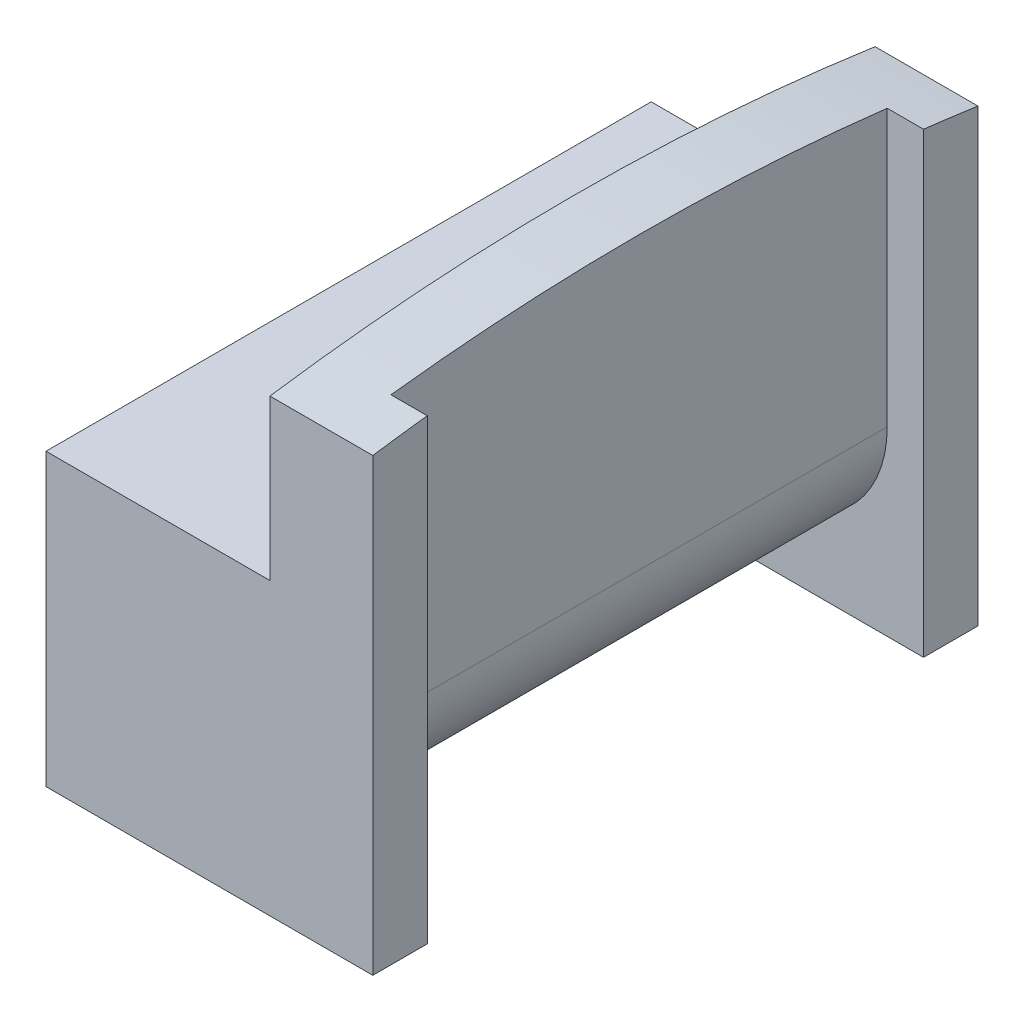
ISO-10303-21;
HEADER;
FILE_DESCRIPTION(('STEP AP214'),'2;1');
FILE_NAME('part.step','',(''),(''),'','','');
FILE_SCHEMA(('AUTOMOTIVE_DESIGN { 1 0 10303 214 1 1 1 1 }'));
ENDSEC;
DATA;
#1=APPLICATION_CONTEXT('core data for automotive mechanical design processes');
#2=APPLICATION_PROTOCOL_DEFINITION('international standard','automotive_design',2000,#1);
#3=PRODUCT_CONTEXT('',#1,'mechanical');
#4=PRODUCT('Part','Part','',(#3));
#5=PRODUCT_RELATED_PRODUCT_CATEGORY('part','',(#4));
#6=PRODUCT_DEFINITION_FORMATION('','',#4);
#7=PRODUCT_DEFINITION_CONTEXT('part definition',#1,'design');
#8=PRODUCT_DEFINITION('design','',#6,#7);
#9=PRODUCT_DEFINITION_SHAPE('','',#8);
#10=(LENGTH_UNIT() NAMED_UNIT(*) SI_UNIT(.MILLI.,.METRE.));
#11=(NAMED_UNIT(*) PLANE_ANGLE_UNIT() SI_UNIT($,.RADIAN.));
#12=(NAMED_UNIT(*) SI_UNIT($,.STERADIAN.) SOLID_ANGLE_UNIT());
#13=UNCERTAINTY_MEASURE_WITH_UNIT(LENGTH_MEASURE(1.E-05),#10,'distance_accuracy_value','');
#14=(GEOMETRIC_REPRESENTATION_CONTEXT(3) GLOBAL_UNCERTAINTY_ASSIGNED_CONTEXT((#13)) GLOBAL_UNIT_ASSIGNED_CONTEXT((#10,
#11,#12)) REPRESENTATION_CONTEXT('',''));
#15=CARTESIAN_POINT('',(0.,0.,0.));
#16=DIRECTION('',(0.,0.,1.));
#17=DIRECTION('',(1.,0.,0.));
#18=AXIS2_PLACEMENT_3D('',#15,#16,#17);
#19=CARTESIAN_POINT('',(119.65,13.5,-2.05));
#20=DIRECTION('',(1.,0.,0.));
#21=DIRECTION('',(0.,1.,0.));
#22=AXIS2_PLACEMENT_3D('',#19,#20,#21);
#23=PLANE('',#22);
#24=CARTESIAN_POINT('',(119.65,0.,0.));
#25=DIRECTION('',(1.,0.,0.));
#26=DIRECTION('',(0.,0.989624467196921,-0.143678160919503));
#27=AXIS2_PLACEMENT_3D('',#24,#25,#26);
#28=CIRCLE('',#27,17.4);
#29=CARTESIAN_POINT('',(119.65,17.21946572923,-2.5));
#30=VERTEX_POINT('',#29);
#31=CARTESIAN_POINT('',(119.65,17.2788165104,-2.05));
#32=VERTEX_POINT('',#31);
#33=EDGE_CURVE('E214',#30,#32,#28,.T.);
#34=ORIENTED_EDGE('',*,*,#33,.T.);
#35=DIRECTION('',(0.,-1.,0.));
#36=VECTOR('',#35,1.);
#37=CARTESIAN_POINT('',(119.65,17.2788165104,-2.05));
#38=LINE('',#37,#36);
#39=CARTESIAN_POINT('',(119.65,13.5,-2.05));
#40=VERTEX_POINT('',#39);
#41=EDGE_CURVE('E174',#32,#40,#38,.T.);
#42=ORIENTED_EDGE('',*,*,#41,.T.);
#43=DIRECTION('',(0.,0.,1.));
#44=VECTOR('',#43,1.);
#45=CARTESIAN_POINT('',(119.65,13.5,-2.5));
#46=LINE('',#45,#44);
#47=CARTESIAN_POINT('',(119.65,13.5,-2.5));
#48=VERTEX_POINT('',#47);
#49=EDGE_CURVE('E11',#48,#40,#46,.T.);
#50=ORIENTED_EDGE('',*,*,#49,.F.);
#51=DIRECTION('',(0.,-1.,0.));
#52=VECTOR('',#51,1.);
#53=CARTESIAN_POINT('',(119.65,17.21946572923,-2.5));
#54=LINE('',#53,#52);
#55=EDGE_CURVE('E225',#30,#48,#54,.T.);
#56=ORIENTED_EDGE('',*,*,#55,.F.);
#57=EDGE_LOOP('',(#34,#42,#50,#56));
#58=FACE_BOUND('',#57,.T.);
#59=ADVANCED_FACE('F17',(#58),#23,.T.);
#60=CARTESIAN_POINT('',(116.95,13.5,-2.05));
#61=DIRECTION('',(0.,-1.,0.));
#62=DIRECTION('',(0.,0.,-1.));
#63=AXIS2_PLACEMENT_3D('',#60,#61,#62);
#64=PLANE('',#63);
#65=DIRECTION('',(-1.,0.,0.));
#66=VECTOR('',#65,1.);
#67=CARTESIAN_POINT('',(119.65,13.5,-2.5));
#68=LINE('',#67,#66);
#69=CARTESIAN_POINT('',(116.95,13.5,-2.5));
#70=VERTEX_POINT('',#69);
#71=EDGE_CURVE('E229',#48,#70,#68,.T.);
#72=ORIENTED_EDGE('',*,*,#71,.F.);
#73=ORIENTED_EDGE('',*,*,#49,.T.);
#74=DIRECTION('',(-1.,0.,0.));
#75=VECTOR('',#74,1.);
#76=CARTESIAN_POINT('',(119.65,13.5,-2.05));
#77=LINE('',#76,#75);
#78=CARTESIAN_POINT('',(116.95,13.5,-2.05));
#79=VERTEX_POINT('',#78);
#80=EDGE_CURVE('E171',#40,#79,#77,.T.);
#81=ORIENTED_EDGE('',*,*,#80,.T.);
#82=DIRECTION('',(0.,0.,1.));
#83=VECTOR('',#82,1.);
#84=CARTESIAN_POINT('',(116.95,13.5,-2.5));
#85=LINE('',#84,#83);
#86=EDGE_CURVE('E89',#70,#79,#85,.T.);
#87=ORIENTED_EDGE('',*,*,#86,.F.);
#88=EDGE_LOOP('',(#72,#73,#81,#87));
#89=FACE_BOUND('',#88,.T.);
#90=ADVANCED_FACE('F486',(#89),#64,.T.);
#91=CARTESIAN_POINT('',(118.8,15.9,-2.05));
#92=DIRECTION('',(0.,1.,0.));
#93=DIRECTION('',(1.,0.,0.));
#94=AXIS2_PLACEMENT_3D('',#91,#92,#93);
#95=PLANE('',#94);
#96=DIRECTION('',(1.,0.,0.));
#97=VECTOR('',#96,1.);
#98=CARTESIAN_POINT('',(116.95,15.9,-2.5));
#99=LINE('',#98,#97);
#100=CARTESIAN_POINT('',(116.95,15.9,-2.5));
#101=VERTEX_POINT('',#100);
#102=CARTESIAN_POINT('',(118.8,15.9,-2.5));
#103=VERTEX_POINT('',#102);
#104=EDGE_CURVE('E239',#101,#103,#99,.T.);
#105=ORIENTED_EDGE('',*,*,#104,.F.);
#106=DIRECTION('',(0.,0.,1.));
#107=VECTOR('',#106,1.);
#108=CARTESIAN_POINT('',(116.95,15.9,-2.5));
#109=LINE('',#108,#107);
#110=CARTESIAN_POINT('',(116.95,15.9,2.5));
#111=VERTEX_POINT('',#110);
#112=EDGE_CURVE('E153',#101,#111,#109,.T.);
#113=ORIENTED_EDGE('',*,*,#112,.T.);
#114=DIRECTION('',(1.,0.,0.));
#115=VECTOR('',#114,1.);
#116=CARTESIAN_POINT('',(116.95,15.9,2.5));
#117=LINE('',#116,#115);
#118=CARTESIAN_POINT('',(118.8,15.9,2.5));
#119=VERTEX_POINT('',#118);
#120=EDGE_CURVE('E143',#111,#119,#117,.T.);
#121=ORIENTED_EDGE('',*,*,#120,.T.);
#122=DIRECTION('',(0.,0.,1.));
#123=VECTOR('',#122,1.);
#124=CARTESIAN_POINT('',(118.8,15.9,-2.5));
#125=LINE('',#124,#123);
#126=EDGE_CURVE('E238',#103,#119,#125,.T.);
#127=ORIENTED_EDGE('',*,*,#126,.F.);
#128=EDGE_LOOP('',(#105,#113,#121,#127));
#129=FACE_BOUND('',#128,.T.);
#130=ADVANCED_FACE('F299',(#129),#95,.T.);
#131=CARTESIAN_POINT('',(116.95,13.5,2.5));
#132=DIRECTION('',(0.,-1.,0.));
#133=DIRECTION('',(0.,0.,-1.));
#134=AXIS2_PLACEMENT_3D('',#131,#132,#133);
#135=PLANE('',#134);
#136=DIRECTION('',(-1.,0.,0.));
#137=VECTOR('',#136,1.);
#138=CARTESIAN_POINT('',(119.65,13.5,2.05));
#139=LINE('',#138,#137);
#140=CARTESIAN_POINT('',(119.65,13.5,2.05));
#141=VERTEX_POINT('',#140);
#142=CARTESIAN_POINT('',(116.95,13.5,2.05));
#143=VERTEX_POINT('',#142);
#144=EDGE_CURVE('E182',#141,#143,#139,.T.);
#145=ORIENTED_EDGE('',*,*,#144,.F.);
#146=DIRECTION('',(0.,0.,1.));
#147=VECTOR('',#146,1.);
#148=CARTESIAN_POINT('',(119.65,13.5,2.05));
#149=LINE('',#148,#147);
#150=CARTESIAN_POINT('',(119.65,13.5,2.5));
#151=VERTEX_POINT('',#150);
#152=EDGE_CURVE('E27',#141,#151,#149,.T.);
#153=ORIENTED_EDGE('',*,*,#152,.T.);
#154=DIRECTION('',(-1.,0.,0.));
#155=VECTOR('',#154,1.);
#156=CARTESIAN_POINT('',(119.65,13.5,2.5));
#157=LINE('',#156,#155);
#158=CARTESIAN_POINT('',(116.95,13.5,2.5));
#159=VERTEX_POINT('',#158);
#160=EDGE_CURVE('E133',#151,#159,#157,.T.);
#161=ORIENTED_EDGE('',*,*,#160,.T.);
#162=DIRECTION('',(0.,0.,1.));
#163=VECTOR('',#162,1.);
#164=CARTESIAN_POINT('',(116.95,13.5,2.05));
#165=LINE('',#164,#163);
#166=EDGE_CURVE('E137',#143,#159,#165,.T.);
#167=ORIENTED_EDGE('',*,*,#166,.F.);
#168=EDGE_LOOP('',(#145,#153,#161,#167));
#169=FACE_BOUND('',#168,.T.);
#170=ADVANCED_FACE('F135',(#169),#135,.T.);
#171=CARTESIAN_POINT('',(119.65,13.5,2.5));
#172=DIRECTION('',(1.,0.,0.));
#173=DIRECTION('',(0.,1.,0.));
#174=AXIS2_PLACEMENT_3D('',#171,#172,#173);
#175=PLANE('',#174);
#176=CARTESIAN_POINT('',(119.65,0.,0.));
#177=DIRECTION('',(1.,0.,0.));
#178=DIRECTION('',(0.,0.993035431632068,0.117816091953996));
#179=AXIS2_PLACEMENT_3D('',#176,#177,#178);
#180=CIRCLE('',#179,17.4);
#181=CARTESIAN_POINT('',(119.65,17.2788165104,2.05));
#182=VERTEX_POINT('',#181);
#183=CARTESIAN_POINT('',(119.65,17.21946572923,2.5));
#184=VERTEX_POINT('',#183);
#185=EDGE_CURVE('E179',#182,#184,#180,.T.);
#186=ORIENTED_EDGE('',*,*,#185,.T.);
#187=DIRECTION('',(0.,-1.,0.));
#188=VECTOR('',#187,1.);
#189=CARTESIAN_POINT('',(119.65,17.21946572923,2.5));
#190=LINE('',#189,#188);
#191=EDGE_CURVE('E142',#184,#151,#190,.T.);
#192=ORIENTED_EDGE('',*,*,#191,.T.);
#193=ORIENTED_EDGE('',*,*,#152,.F.);
#194=DIRECTION('',(0.,-1.,0.));
#195=VECTOR('',#194,1.);
#196=CARTESIAN_POINT('',(119.65,17.2788165104,2.05));
#197=LINE('',#196,#195);
#198=EDGE_CURVE('E207',#182,#141,#197,.T.);
#199=ORIENTED_EDGE('',*,*,#198,.F.);
#200=EDGE_LOOP('',(#186,#192,#193,#199));
#201=FACE_BOUND('',#200,.T.);
#202=ADVANCED_FACE('F317',(#201),#175,.T.);
#203=CARTESIAN_POINT('',(118.5102272727,15.23977272727,2.5));
#204=DIRECTION('',(0.,0.,-1.));
#205=DIRECTION('',(0.,-1.,0.));
#206=AXIS2_PLACEMENT_3D('',#203,#204,#205);
#207=PLANE('',#206);
#208=DIRECTION('',(1.,0.,0.));
#209=VECTOR('',#208,1.);
#210=CARTESIAN_POINT('',(118.8,17.21946572923,2.5));
#211=LINE('',#210,#209);
#212=CARTESIAN_POINT('',(118.8,17.21946572923,2.5));
#213=VERTEX_POINT('',#212);
#214=EDGE_CURVE('E175',#213,#184,#211,.T.);
#215=ORIENTED_EDGE('',*,*,#214,.F.);
#216=DIRECTION('',(0.,1.,0.));
#217=VECTOR('',#216,1.);
#218=CARTESIAN_POINT('',(118.8,15.9,2.5));
#219=LINE('',#218,#217);
#220=EDGE_CURVE('E248',#119,#213,#219,.T.);
#221=ORIENTED_EDGE('',*,*,#220,.F.);
#222=ORIENTED_EDGE('',*,*,#120,.F.);
#223=DIRECTION('',(0.,1.,0.));
#224=VECTOR('',#223,1.);
#225=CARTESIAN_POINT('',(116.95,13.5,2.5));
#226=LINE('',#225,#224);
#227=EDGE_CURVE('E146',#159,#111,#226,.T.);
#228=ORIENTED_EDGE('',*,*,#227,.F.);
#229=ORIENTED_EDGE('',*,*,#160,.F.);
#230=ORIENTED_EDGE('',*,*,#191,.F.);
#231=EDGE_LOOP('',(#215,#221,#222,#228,#229,#230));
#232=FACE_BOUND('',#231,.T.);
#233=ADVANCED_FACE('F148',(#232),#207,.F.);
#234=CARTESIAN_POINT('',(118.8,17.4,-2.05));
#235=DIRECTION('',(-1.,0.,0.));
#236=DIRECTION('',(0.,0.,1.));
#237=AXIS2_PLACEMENT_3D('',#234,#235,#236);
#238=PLANE('',#237);
#239=CARTESIAN_POINT('',(118.8,0.,0.));
#240=DIRECTION('',(-1.,0.,0.));
#241=DIRECTION('',(0.,0.989624467196921,0.143678160919503));
#242=AXIS2_PLACEMENT_3D('',#239,#240,#241);
#243=CIRCLE('',#242,17.4);
#244=CARTESIAN_POINT('',(118.8,17.21946572923,-2.5));
#245=VERTEX_POINT('',#244);
#246=EDGE_CURVE('E180',#213,#245,#243,.T.);
#247=ORIENTED_EDGE('',*,*,#246,.T.);
#248=DIRECTION('',(0.,1.,0.));
#249=VECTOR('',#248,1.);
#250=CARTESIAN_POINT('',(118.8,15.9,-2.5));
#251=LINE('',#250,#249);
#252=EDGE_CURVE('E234',#103,#245,#251,.T.);
#253=ORIENTED_EDGE('',*,*,#252,.F.);
#254=ORIENTED_EDGE('',*,*,#126,.T.);
#255=ORIENTED_EDGE('',*,*,#220,.T.);
#256=EDGE_LOOP('',(#247,#253,#254,#255));
#257=FACE_BOUND('',#256,.T.);
#258=ADVANCED_FACE('F300',(#257),#238,.T.);
#259=CARTESIAN_POINT('',(118.5102272727,15.23977272727,-2.5));
#260=DIRECTION('',(0.,0.,-1.));
#261=DIRECTION('',(0.,-1.,0.));
#262=AXIS2_PLACEMENT_3D('',#259,#260,#261);
#263=PLANE('',#262);
#264=DIRECTION('',(-1.,0.,0.));
#265=VECTOR('',#264,1.);
#266=CARTESIAN_POINT('',(119.65,17.21946572923,-2.5));
#267=LINE('',#266,#265);
#268=EDGE_CURVE('E253',#30,#245,#267,.T.);
#269=ORIENTED_EDGE('',*,*,#268,.F.);
#270=ORIENTED_EDGE('',*,*,#55,.T.);
#271=ORIENTED_EDGE('',*,*,#71,.T.);
#272=DIRECTION('',(0.,1.,0.));
#273=VECTOR('',#272,1.);
#274=CARTESIAN_POINT('',(116.95,13.5,-2.5));
#275=LINE('',#274,#273);
#276=EDGE_CURVE('E165',#70,#101,#275,.T.);
#277=ORIENTED_EDGE('',*,*,#276,.T.);
#278=ORIENTED_EDGE('',*,*,#104,.T.);
#279=ORIENTED_EDGE('',*,*,#252,.T.);
#280=EDGE_LOOP('',(#269,#270,#271,#277,#278,#279));
#281=FACE_BOUND('',#280,.T.);
#282=ADVANCED_FACE('F296',(#281),#263,.T.);
#283=CARTESIAN_POINT('',(116.95,15.9,-2.05));
#284=DIRECTION('',(-1.,0.,0.));
#285=DIRECTION('',(0.,0.,1.));
#286=AXIS2_PLACEMENT_3D('',#283,#284,#285);
#287=PLANE('',#286);
#288=ORIENTED_EDGE('',*,*,#276,.F.);
#289=ORIENTED_EDGE('',*,*,#86,.T.);
#290=DIRECTION('',(0.,1.,0.));
#291=VECTOR('',#290,1.);
#292=CARTESIAN_POINT('',(116.95,13.5,-2.05));
#293=LINE('',#292,#291);
#294=CARTESIAN_POINT('',(116.95,14.,-2.05));
#295=VERTEX_POINT('',#294);
#296=EDGE_CURVE('E169',#79,#295,#293,.T.);
#297=ORIENTED_EDGE('',*,*,#296,.T.);
#298=DIRECTION('',(0.,0.,1.));
#299=VECTOR('',#298,1.);
#300=CARTESIAN_POINT('',(116.95,14.,-2.05));
#301=LINE('',#300,#299);
#302=CARTESIAN_POINT('',(116.95,14.,2.05));
#303=VERTEX_POINT('',#302);
#304=EDGE_CURVE('E78',#295,#303,#301,.T.);
#305=ORIENTED_EDGE('',*,*,#304,.T.);
#306=DIRECTION('',(0.,1.,0.));
#307=VECTOR('',#306,1.);
#308=CARTESIAN_POINT('',(116.95,13.5,2.05));
#309=LINE('',#308,#307);
#310=EDGE_CURVE('E157',#143,#303,#309,.T.);
#311=ORIENTED_EDGE('',*,*,#310,.F.);
#312=ORIENTED_EDGE('',*,*,#166,.T.);
#313=ORIENTED_EDGE('',*,*,#227,.T.);
#314=ORIENTED_EDGE('',*,*,#112,.F.);
#315=EDGE_LOOP('',(#288,#289,#297,#305,#311,#312,#313,#314));
#316=FACE_BOUND('',#315,.T.);
#317=ADVANCED_FACE('F155',(#316),#287,.T.);
#318=CARTESIAN_POINT('',(116.95,14.,2.5));
#319=DIRECTION('',(0.,-1.,0.));
#320=DIRECTION('',(0.,0.,-1.));
#321=AXIS2_PLACEMENT_3D('',#318,#319,#320);
#322=PLANE('',#321);
#323=DIRECTION('',(1.,0.,0.));
#324=VECTOR('',#323,1.);
#325=CARTESIAN_POINT('',(116.95,14.,-2.05));
#326=LINE('',#325,#324);
#327=CARTESIAN_POINT('',(118.35,14.,-2.05));
#328=VERTEX_POINT('',#327);
#329=EDGE_CURVE('E216',#295,#328,#326,.T.);
#330=ORIENTED_EDGE('',*,*,#329,.T.);
#331=DIRECTION('',(0.,0.,-1.));
#332=VECTOR('',#331,1.);
#333=CARTESIAN_POINT('',(118.35,14.,2.05));
#334=LINE('',#333,#332);
#335=CARTESIAN_POINT('',(118.35,14.,2.05));
#336=VERTEX_POINT('',#335);
#337=EDGE_CURVE('E193',#336,#328,#334,.T.);
#338=ORIENTED_EDGE('',*,*,#337,.F.);
#339=DIRECTION('',(-1.,0.,0.));
#340=VECTOR('',#339,1.);
#341=CARTESIAN_POINT('',(118.35,14.,2.05));
#342=LINE('',#341,#340);
#343=EDGE_CURVE('E20',#336,#303,#342,.T.);
#344=ORIENTED_EDGE('',*,*,#343,.T.);
#345=ORIENTED_EDGE('',*,*,#304,.F.);
#346=EDGE_LOOP('',(#330,#338,#344,#345));
#347=FACE_BOUND('',#346,.T.);
#348=ADVANCED_FACE('F444',(#347),#322,.T.);
#349=CARTESIAN_POINT('',(118.5102272727,15.23977272727,2.05));
#350=DIRECTION('',(0.,0.,-1.));
#351=DIRECTION('',(0.,-1.,0.));
#352=AXIS2_PLACEMENT_3D('',#349,#350,#351);
#353=PLANE('',#352);
#354=DIRECTION('',(-1.,0.,0.));
#355=VECTOR('',#354,1.);
#356=CARTESIAN_POINT('',(119.65,17.2788165104,2.05));
#357=LINE('',#356,#355);
#358=CARTESIAN_POINT('',(119.35,17.2788165104,2.05));
#359=VERTEX_POINT('',#358);
#360=EDGE_CURVE('E195',#182,#359,#357,.T.);
#361=ORIENTED_EDGE('',*,*,#360,.F.);
#362=ORIENTED_EDGE('',*,*,#198,.T.);
#363=ORIENTED_EDGE('',*,*,#144,.T.);
#364=ORIENTED_EDGE('',*,*,#310,.T.);
#365=ORIENTED_EDGE('',*,*,#343,.F.);
#366=CARTESIAN_POINT('',(118.35,15.,2.05));
#367=DIRECTION('',(0.,0.,1.));
#368=DIRECTION('',(0.,-1.,0.));
#369=AXIS2_PLACEMENT_3D('',#366,#367,#368);
#370=CIRCLE('',#369,1.);
#371=CARTESIAN_POINT('',(119.35,15.,2.05));
#372=VERTEX_POINT('',#371);
#373=EDGE_CURVE('E240',#336,#372,#370,.T.);
#374=ORIENTED_EDGE('',*,*,#373,.T.);
#375=DIRECTION('',(0.,-1.,0.));
#376=VECTOR('',#375,1.);
#377=CARTESIAN_POINT('',(119.35,17.2788165104,2.05));
#378=LINE('',#377,#376);
#379=EDGE_CURVE('E198',#359,#372,#378,.T.);
#380=ORIENTED_EDGE('',*,*,#379,.F.);
#381=EDGE_LOOP('',(#361,#362,#363,#364,#365,#374,#380));
#382=FACE_BOUND('',#381,.T.);
#383=ADVANCED_FACE('F319',(#382),#353,.T.);
#384=CARTESIAN_POINT('',(119.35,15.,2.5));
#385=DIRECTION('',(1.,0.,0.));
#386=DIRECTION('',(0.,1.,0.));
#387=AXIS2_PLACEMENT_3D('',#384,#385,#386);
#388=PLANE('',#387);
#389=CARTESIAN_POINT('',(119.35,0.,0.));
#390=DIRECTION('',(1.,0.,0.));
#391=DIRECTION('',(0.,0.993035431632068,-0.117816091953996));
#392=AXIS2_PLACEMENT_3D('',#389,#390,#391);
#393=CIRCLE('',#392,17.4);
#394=CARTESIAN_POINT('',(119.35,17.2788165104,-2.05));
#395=VERTEX_POINT('',#394);
#396=EDGE_CURVE('E275',#395,#359,#393,.T.);
#397=ORIENTED_EDGE('',*,*,#396,.T.);
#398=ORIENTED_EDGE('',*,*,#379,.T.);
#399=DIRECTION('',(0.,0.,1.));
#400=VECTOR('',#399,1.);
#401=CARTESIAN_POINT('',(119.35,15.,-2.05));
#402=LINE('',#401,#400);
#403=CARTESIAN_POINT('',(119.35,15.,-2.05));
#404=VERTEX_POINT('',#403);
#405=EDGE_CURVE('E223',#404,#372,#402,.T.);
#406=ORIENTED_EDGE('',*,*,#405,.F.);
#407=DIRECTION('',(0.,1.,0.));
#408=VECTOR('',#407,1.);
#409=CARTESIAN_POINT('',(119.35,15.,-2.05));
#410=LINE('',#409,#408);
#411=EDGE_CURVE('E219',#404,#395,#410,.T.);
#412=ORIENTED_EDGE('',*,*,#411,.T.);
#413=EDGE_LOOP('',(#397,#398,#406,#412));
#414=FACE_BOUND('',#413,.T.);
#415=ADVANCED_FACE('F464',(#414),#388,.T.);
#416=CARTESIAN_POINT('',(118.95,0.,0.));
#417=DIRECTION('',(-1.,0.,0.));
#418=DIRECTION('',(0.,1.,0.));
#419=AXIS2_PLACEMENT_3D('',#416,#417,#418);
#420=CYLINDRICAL_SURFACE('',#419,17.4);
#421=ORIENTED_EDGE('',*,*,#396,.F.);
#422=DIRECTION('',(1.,0.,0.));
#423=VECTOR('',#422,1.);
#424=CARTESIAN_POINT('',(119.35,17.2788165104,-2.05));
#425=LINE('',#424,#423);
#426=EDGE_CURVE('E233',#395,#32,#425,.T.);
#427=ORIENTED_EDGE('',*,*,#426,.T.);
#428=ORIENTED_EDGE('',*,*,#33,.F.);
#429=ORIENTED_EDGE('',*,*,#268,.T.);
#430=ORIENTED_EDGE('',*,*,#246,.F.);
#431=ORIENTED_EDGE('',*,*,#214,.T.);
#432=ORIENTED_EDGE('',*,*,#185,.F.);
#433=ORIENTED_EDGE('',*,*,#360,.T.);
#434=EDGE_LOOP('',(#421,#427,#428,#429,#430,#431,#432,#433));
#435=FACE_BOUND('',#434,.T.);
#436=ADVANCED_FACE('F320',(#435),#420,.T.);
#437=CARTESIAN_POINT('',(118.5102272727,15.23977272727,-2.05));
#438=DIRECTION('',(0.,0.,-1.));
#439=DIRECTION('',(0.,-1.,0.));
#440=AXIS2_PLACEMENT_3D('',#437,#438,#439);
#441=PLANE('',#440);
#442=ORIENTED_EDGE('',*,*,#426,.F.);
#443=ORIENTED_EDGE('',*,*,#411,.F.);
#444=CARTESIAN_POINT('',(118.35,15.,-2.05));
#445=DIRECTION('',(0.,0.,-1.));
#446=DIRECTION('',(1.,0.,0.));
#447=AXIS2_PLACEMENT_3D('',#444,#445,#446);
#448=CIRCLE('',#447,1.);
#449=EDGE_CURVE('E220',#404,#328,#448,.T.);
#450=ORIENTED_EDGE('',*,*,#449,.T.);
#451=ORIENTED_EDGE('',*,*,#329,.F.);
#452=ORIENTED_EDGE('',*,*,#296,.F.);
#453=ORIENTED_EDGE('',*,*,#80,.F.);
#454=ORIENTED_EDGE('',*,*,#41,.F.);
#455=EDGE_LOOP('',(#442,#443,#450,#451,#452,#453,#454));
#456=FACE_BOUND('',#455,.T.);
#457=ADVANCED_FACE('F421',(#456),#441,.F.);
#458=CARTESIAN_POINT('',(118.35,15.,2.5));
#459=DIRECTION('',(0.,0.,1.));
#460=DIRECTION('',(1.,0.,0.));
#461=AXIS2_PLACEMENT_3D('',#458,#459,#460);
#462=CYLINDRICAL_SURFACE('',#461,1.);
#463=ORIENTED_EDGE('',*,*,#449,.F.);
#464=ORIENTED_EDGE('',*,*,#405,.T.);
#465=ORIENTED_EDGE('',*,*,#373,.F.);
#466=ORIENTED_EDGE('',*,*,#337,.T.);
#467=EDGE_LOOP('',(#463,#464,#465,#466));
#468=FACE_BOUND('',#467,.T.);
#469=ADVANCED_FACE('F416',(#468),#462,.T.);
#470=CLOSED_SHELL('',(#59,#90,#130,#170,#202,#233,#258,#282,#317,#348,#383,#415,#436,#457,#469));
#471=MANIFOLD_SOLID_BREP('B1',#470);
#472=ADVANCED_BREP_SHAPE_REPRESENTATION('',(#18,#471),#14);
#473=SHAPE_DEFINITION_REPRESENTATION(#9,#472);
ENDSEC;
END-ISO-10303-21;
